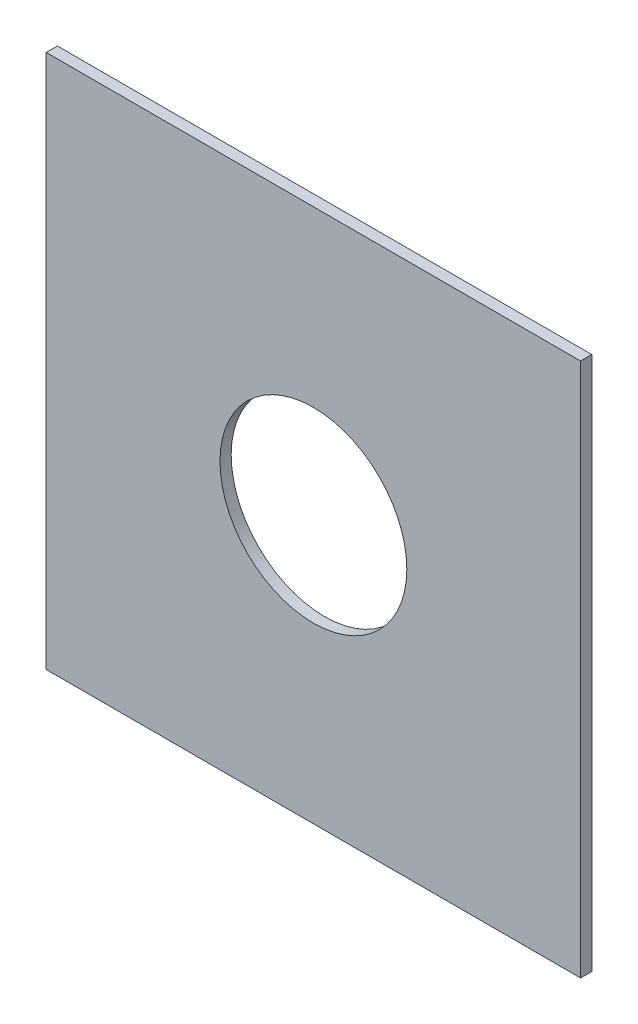
ISO-10303-21;
HEADER;
FILE_DESCRIPTION(('STEP AP214'),'2;1');
FILE_NAME('part.step','',(''),(''),'','','');
FILE_SCHEMA(('AUTOMOTIVE_DESIGN { 1 0 10303 214 1 1 1 1 }'));
ENDSEC;
DATA;
#1=APPLICATION_CONTEXT('core data for automotive mechanical design processes');
#2=APPLICATION_PROTOCOL_DEFINITION('international standard','automotive_design',2000,#1);
#3=PRODUCT_CONTEXT('',#1,'mechanical');
#4=PRODUCT('Part','Part','',(#3));
#5=PRODUCT_RELATED_PRODUCT_CATEGORY('part','',(#4));
#6=PRODUCT_DEFINITION_FORMATION('','',#4);
#7=PRODUCT_DEFINITION_CONTEXT('part definition',#1,'design');
#8=PRODUCT_DEFINITION('design','',#6,#7);
#9=PRODUCT_DEFINITION_SHAPE('','',#8);
#10=(LENGTH_UNIT() NAMED_UNIT(*) SI_UNIT(.MILLI.,.METRE.));
#11=(NAMED_UNIT(*) PLANE_ANGLE_UNIT() SI_UNIT($,.RADIAN.));
#12=(NAMED_UNIT(*) SI_UNIT($,.STERADIAN.) SOLID_ANGLE_UNIT());
#13=UNCERTAINTY_MEASURE_WITH_UNIT(LENGTH_MEASURE(1.E-05),#10,'distance_accuracy_value','');
#14=(GEOMETRIC_REPRESENTATION_CONTEXT(3) GLOBAL_UNCERTAINTY_ASSIGNED_CONTEXT((#13)) GLOBAL_UNIT_ASSIGNED_CONTEXT((#10,
#11,#12)) REPRESENTATION_CONTEXT('',''));
#15=CARTESIAN_POINT('',(0.,0.,0.));
#16=DIRECTION('',(0.,0.,1.));
#17=DIRECTION('',(1.,0.,0.));
#18=AXIS2_PLACEMENT_3D('',#15,#16,#17);
#19=CARTESIAN_POINT('',(0.,0.,3.));
#20=DIRECTION('',(0.,0.,-1.));
#21=DIRECTION('',(-1.,0.,0.));
#22=AXIS2_PLACEMENT_3D('',#19,#20,#21);
#23=PLANE('',#22);
#24=DIRECTION('',(0.,1.,0.));
#25=VECTOR('',#24,1.);
#26=CARTESIAN_POINT('',(71.5,-71.5,3.));
#27=LINE('',#26,#25);
#28=CARTESIAN_POINT('',(71.5,-71.5,3.));
#29=VERTEX_POINT('',#28);
#30=CARTESIAN_POINT('',(71.5,71.5,3.));
#31=VERTEX_POINT('',#30);
#32=EDGE_CURVE('E85',#29,#31,#27,.T.);
#33=ORIENTED_EDGE('',*,*,#32,.T.);
#34=DIRECTION('',(-1.,0.,0.));
#35=VECTOR('',#34,1.);
#36=CARTESIAN_POINT('',(-71.5,71.5,3.));
#37=LINE('',#36,#35);
#38=CARTESIAN_POINT('',(-71.5,71.5,3.));
#39=VERTEX_POINT('',#38);
#40=EDGE_CURVE('E80',#31,#39,#37,.T.);
#41=ORIENTED_EDGE('',*,*,#40,.T.);
#42=DIRECTION('',(0.,-1.,0.));
#43=VECTOR('',#42,1.);
#44=CARTESIAN_POINT('',(-71.5,-71.5,3.));
#45=LINE('',#44,#43);
#46=CARTESIAN_POINT('',(-71.5,-71.5,3.));
#47=VERTEX_POINT('',#46);
#48=EDGE_CURVE('E83',#39,#47,#45,.T.);
#49=ORIENTED_EDGE('',*,*,#48,.T.);
#50=DIRECTION('',(1.,0.,0.));
#51=VECTOR('',#50,1.);
#52=CARTESIAN_POINT('',(-71.5,-71.5,3.));
#53=LINE('',#52,#51);
#54=EDGE_CURVE('E50',#47,#29,#53,.T.);
#55=ORIENTED_EDGE('',*,*,#54,.T.);
#56=EDGE_LOOP('',(#33,#41,#49,#55));
#57=FACE_BOUND('',#56,.T.);
#58=CARTESIAN_POINT('',(0.,0.,3.));
#59=DIRECTION('',(0.,0.,1.));
#60=DIRECTION('',(1.,0.,0.));
#61=AXIS2_PLACEMENT_3D('',#58,#59,#60);
#62=CIRCLE('',#61,25.);
#63=CARTESIAN_POINT('',(25.,0.,3.));
#64=VERTEX_POINT('',#63);
#65=EDGE_CURVE('E100',#64,#64,#62,.T.);
#66=ORIENTED_EDGE('',*,*,#65,.F.);
#67=EDGE_LOOP('',(#66));
#68=FACE_BOUND('',#67,.T.);
#69=ADVANCED_FACE('F33',(#57,#68),#23,.F.);
#70=CARTESIAN_POINT('',(0.,0.,0.));
#71=DIRECTION('',(0.,0.,-1.));
#72=DIRECTION('',(-1.,0.,0.));
#73=AXIS2_PLACEMENT_3D('',#70,#71,#72);
#74=PLANE('',#73);
#75=DIRECTION('',(0.,1.,0.));
#76=VECTOR('',#75,1.);
#77=CARTESIAN_POINT('',(71.5,-71.5,0.));
#78=LINE('',#77,#76);
#79=CARTESIAN_POINT('',(71.5,-71.5,0.));
#80=VERTEX_POINT('',#79);
#81=CARTESIAN_POINT('',(71.5,71.5,0.));
#82=VERTEX_POINT('',#81);
#83=EDGE_CURVE('E97',#80,#82,#78,.T.);
#84=ORIENTED_EDGE('',*,*,#83,.F.);
#85=DIRECTION('',(1.,0.,0.));
#86=VECTOR('',#85,1.);
#87=CARTESIAN_POINT('',(-71.5,-71.5,0.));
#88=LINE('',#87,#86);
#89=CARTESIAN_POINT('',(-71.5,-71.5,0.));
#90=VERTEX_POINT('',#89);
#91=EDGE_CURVE('E73',#90,#80,#88,.T.);
#92=ORIENTED_EDGE('',*,*,#91,.F.);
#93=DIRECTION('',(0.,-1.,0.));
#94=VECTOR('',#93,1.);
#95=CARTESIAN_POINT('',(-71.5,-71.5,0.));
#96=LINE('',#95,#94);
#97=CARTESIAN_POINT('',(-71.5,71.5,0.));
#98=VERTEX_POINT('',#97);
#99=EDGE_CURVE('E67',#98,#90,#96,.T.);
#100=ORIENTED_EDGE('',*,*,#99,.F.);
#101=DIRECTION('',(-1.,0.,0.));
#102=VECTOR('',#101,1.);
#103=CARTESIAN_POINT('',(-71.5,71.5,0.));
#104=LINE('',#103,#102);
#105=EDGE_CURVE('E89',#82,#98,#104,.T.);
#106=ORIENTED_EDGE('',*,*,#105,.F.);
#107=EDGE_LOOP('',(#84,#92,#100,#106));
#108=FACE_BOUND('',#107,.T.);
#109=CARTESIAN_POINT('',(0.,0.,0.));
#110=DIRECTION('',(0.,0.,1.));
#111=DIRECTION('',(1.,0.,0.));
#112=AXIS2_PLACEMENT_3D('',#109,#110,#111);
#113=CIRCLE('',#112,25.);
#114=CARTESIAN_POINT('',(25.,0.,0.));
#115=VERTEX_POINT('',#114);
#116=EDGE_CURVE('E112',#115,#115,#113,.T.);
#117=ORIENTED_EDGE('',*,*,#116,.T.);
#118=EDGE_LOOP('',(#117));
#119=FACE_BOUND('',#118,.T.);
#120=ADVANCED_FACE('F108',(#108,#119),#74,.T.);
#121=CARTESIAN_POINT('',(71.5,-71.5,3.));
#122=DIRECTION('',(-1.,0.,0.));
#123=DIRECTION('',(0.,0.,1.));
#124=AXIS2_PLACEMENT_3D('',#121,#122,#123);
#125=PLANE('',#124);
#126=ORIENTED_EDGE('',*,*,#83,.T.);
#127=DIRECTION('',(0.,0.,-1.));
#128=VECTOR('',#127,1.);
#129=CARTESIAN_POINT('',(71.5,71.5,3.));
#130=LINE('',#129,#128);
#131=EDGE_CURVE('E11',#31,#82,#130,.T.);
#132=ORIENTED_EDGE('',*,*,#131,.F.);
#133=ORIENTED_EDGE('',*,*,#32,.F.);
#134=DIRECTION('',(0.,0.,-1.));
#135=VECTOR('',#134,1.);
#136=CARTESIAN_POINT('',(71.5,-71.5,3.));
#137=LINE('',#136,#135);
#138=EDGE_CURVE('E93',#29,#80,#137,.T.);
#139=ORIENTED_EDGE('',*,*,#138,.T.);
#140=EDGE_LOOP('',(#126,#132,#133,#139));
#141=FACE_BOUND('',#140,.T.);
#142=ADVANCED_FACE('F35',(#141),#125,.F.);
#143=CARTESIAN_POINT('',(-71.5,71.5,3.));
#144=DIRECTION('',(0.,-1.,0.));
#145=DIRECTION('',(0.,0.,-1.));
#146=AXIS2_PLACEMENT_3D('',#143,#144,#145);
#147=PLANE('',#146);
#148=ORIENTED_EDGE('',*,*,#105,.T.);
#149=DIRECTION('',(0.,0.,-1.));
#150=VECTOR('',#149,1.);
#151=CARTESIAN_POINT('',(-71.5,71.5,3.));
#152=LINE('',#151,#150);
#153=EDGE_CURVE('E42',#39,#98,#152,.T.);
#154=ORIENTED_EDGE('',*,*,#153,.F.);
#155=ORIENTED_EDGE('',*,*,#40,.F.);
#156=ORIENTED_EDGE('',*,*,#131,.T.);
#157=EDGE_LOOP('',(#148,#154,#155,#156));
#158=FACE_BOUND('',#157,.T.);
#159=ADVANCED_FACE('F88',(#158),#147,.F.);
#160=CARTESIAN_POINT('',(-71.5,-71.5,3.));
#161=DIRECTION('',(1.,0.,0.));
#162=DIRECTION('',(0.,0.,-1.));
#163=AXIS2_PLACEMENT_3D('',#160,#161,#162);
#164=PLANE('',#163);
#165=ORIENTED_EDGE('',*,*,#99,.T.);
#166=DIRECTION('',(0.,0.,-1.));
#167=VECTOR('',#166,1.);
#168=CARTESIAN_POINT('',(-71.5,-71.5,3.));
#169=LINE('',#168,#167);
#170=EDGE_CURVE('E90',#47,#90,#169,.T.);
#171=ORIENTED_EDGE('',*,*,#170,.F.);
#172=ORIENTED_EDGE('',*,*,#48,.F.);
#173=ORIENTED_EDGE('',*,*,#153,.T.);
#174=EDGE_LOOP('',(#165,#171,#172,#173));
#175=FACE_BOUND('',#174,.T.);
#176=ADVANCED_FACE('F91',(#175),#164,.F.);
#177=CARTESIAN_POINT('',(-71.5,-71.5,3.));
#178=DIRECTION('',(0.,1.,0.));
#179=DIRECTION('',(0.,0.,1.));
#180=AXIS2_PLACEMENT_3D('',#177,#178,#179);
#181=PLANE('',#180);
#182=ORIENTED_EDGE('',*,*,#91,.T.);
#183=ORIENTED_EDGE('',*,*,#138,.F.);
#184=ORIENTED_EDGE('',*,*,#54,.F.);
#185=ORIENTED_EDGE('',*,*,#170,.T.);
#186=EDGE_LOOP('',(#182,#183,#184,#185));
#187=FACE_BOUND('',#186,.T.);
#188=ADVANCED_FACE('F105',(#187),#181,.F.);
#189=CARTESIAN_POINT('',(0.,0.,3.));
#190=DIRECTION('',(0.,0.,-1.));
#191=DIRECTION('',(-1.,0.,0.));
#192=AXIS2_PLACEMENT_3D('',#189,#190,#191);
#193=CYLINDRICAL_SURFACE('',#192,25.);
#194=ORIENTED_EDGE('',*,*,#65,.T.);
#195=EDGE_LOOP('',(#194));
#196=FACE_BOUND('',#195,.T.);
#197=ORIENTED_EDGE('',*,*,#116,.F.);
#198=EDGE_LOOP('',(#197));
#199=FACE_BOUND('',#198,.T.);
#200=ADVANCED_FACE('F118',(#196,#199),#193,.F.);
#201=CLOSED_SHELL('',(#69,#120,#142,#159,#176,#188,#200));
#202=MANIFOLD_SOLID_BREP('B2',#201);
#203=ADVANCED_BREP_SHAPE_REPRESENTATION('',(#18,#202),#14);
#204=SHAPE_DEFINITION_REPRESENTATION(#9,#203);
ENDSEC;
END-ISO-10303-21;
